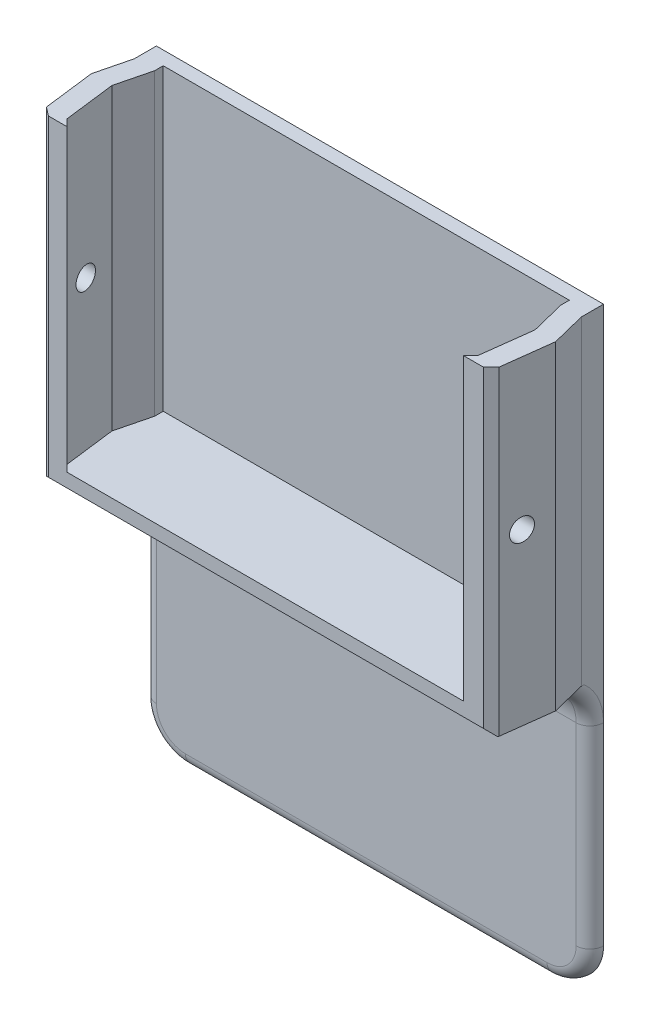
ISO-10303-21;
HEADER;
FILE_DESCRIPTION(('STEP AP214'),'2;1');
FILE_NAME('part.step','',(''),(''),'','','');
FILE_SCHEMA(('AUTOMOTIVE_DESIGN { 1 0 10303 214 1 1 1 1 }'));
ENDSEC;
DATA;
#1=APPLICATION_CONTEXT('core data for automotive mechanical design processes');
#2=APPLICATION_PROTOCOL_DEFINITION('international standard','automotive_design',2000,#1);
#3=PRODUCT_CONTEXT('',#1,'mechanical');
#4=PRODUCT('Part','Part','',(#3));
#5=PRODUCT_RELATED_PRODUCT_CATEGORY('part','',(#4));
#6=PRODUCT_DEFINITION_FORMATION('','',#4);
#7=PRODUCT_DEFINITION_CONTEXT('part definition',#1,'design');
#8=PRODUCT_DEFINITION('design','',#6,#7);
#9=PRODUCT_DEFINITION_SHAPE('','',#8);
#10=(LENGTH_UNIT() NAMED_UNIT(*) SI_UNIT(.MILLI.,.METRE.));
#11=(NAMED_UNIT(*) PLANE_ANGLE_UNIT() SI_UNIT($,.RADIAN.));
#12=(NAMED_UNIT(*) SI_UNIT($,.STERADIAN.) SOLID_ANGLE_UNIT());
#13=UNCERTAINTY_MEASURE_WITH_UNIT(LENGTH_MEASURE(1.E-05),#10,'distance_accuracy_value','');
#14=(GEOMETRIC_REPRESENTATION_CONTEXT(3) GLOBAL_UNCERTAINTY_ASSIGNED_CONTEXT((#13)) GLOBAL_UNIT_ASSIGNED_CONTEXT((#10,
#11,#12)) REPRESENTATION_CONTEXT('',''));
#15=CARTESIAN_POINT('',(0.,0.,0.));
#16=DIRECTION('',(0.,0.,1.));
#17=DIRECTION('',(1.,0.,0.));
#18=AXIS2_PLACEMENT_3D('',#15,#16,#17);
#19=CARTESIAN_POINT('',(-23.75,-17.5,1.));
#20=DIRECTION('',(0.,-1.,0.));
#21=DIRECTION('',(0.,0.,-1.));
#22=AXIS2_PLACEMENT_3D('',#19,#20,#21);
#23=PLANE('',#22);
#24=DIRECTION('',(-0.707106781186551,0.,-0.707106781186544));
#25=VECTOR('',#24,1.);
#26=CARTESIAN_POINT('',(-28.875,-17.5,6.12500000000005));
#27=LINE('',#26,#25);
#28=CARTESIAN_POINT('',(-23.2,-17.5,11.8));
#29=VERTEX_POINT('',#28);
#30=CARTESIAN_POINT('',(-24.,-17.5,11.));
#31=VERTEX_POINT('',#30);
#32=EDGE_CURVE('E276',#29,#31,#27,.T.);
#33=ORIENTED_EDGE('',*,*,#32,.F.);
#34=DIRECTION('',(1.,0.,0.));
#35=VECTOR('',#34,1.);
#36=CARTESIAN_POINT('',(-23.75,-17.5,11.8));
#37=LINE('',#36,#35);
#38=CARTESIAN_POINT('',(23.2,-17.5,11.8));
#39=VERTEX_POINT('',#38);
#40=EDGE_CURVE('E246',#29,#39,#37,.T.);
#41=ORIENTED_EDGE('',*,*,#40,.T.);
#42=DIRECTION('',(0.707106781186551,0.,-0.707106781186544));
#43=VECTOR('',#42,1.);
#44=CARTESIAN_POINT('',(5.12499999999977,-17.5,29.875));
#45=LINE('',#44,#43);
#46=CARTESIAN_POINT('',(24.,-17.5,11.));
#47=VERTEX_POINT('',#46);
#48=EDGE_CURVE('E290',#39,#47,#45,.T.);
#49=ORIENTED_EDGE('',*,*,#48,.T.);
#50=DIRECTION('',(0.124034734589208,0.,-0.992277876713668));
#51=VECTOR('',#50,1.);
#52=CARTESIAN_POINT('',(24.4961538461538,-17.5,7.03076923076921));
#53=LINE('',#52,#51);
#54=CARTESIAN_POINT('',(24.75,-17.5,5.));
#55=VERTEX_POINT('',#54);
#56=EDGE_CURVE('E321',#47,#55,#53,.T.);
#57=ORIENTED_EDGE('',*,*,#56,.T.);
#58=DIRECTION('',(-0.242535625036333,0.,-0.970142500145332));
#59=VECTOR('',#58,1.);
#60=CARTESIAN_POINT('',(20.9558823529412,-17.5,-10.1764705882353));
#61=LINE('',#60,#59);
#62=CARTESIAN_POINT('',(23.75,-17.5,1.));
#63=VERTEX_POINT('',#62);
#64=EDGE_CURVE('E325',#55,#63,#61,.T.);
#65=ORIENTED_EDGE('',*,*,#64,.T.);
#66=DIRECTION('',(0.,0.,-1.));
#67=VECTOR('',#66,1.);
#68=CARTESIAN_POINT('',(23.75,-17.5,1.));
#69=LINE('',#68,#67);
#70=CARTESIAN_POINT('',(23.75,-17.5,0.));
#71=VERTEX_POINT('',#70);
#72=EDGE_CURVE('E390',#63,#71,#69,.T.);
#73=ORIENTED_EDGE('',*,*,#72,.T.);
#74=DIRECTION('',(-1.,0.,0.));
#75=VECTOR('',#74,1.);
#76=CARTESIAN_POINT('',(-23.75,-17.5,0.));
#77=LINE('',#76,#75);
#78=CARTESIAN_POINT('',(-23.75,-17.5,0.));
#79=VERTEX_POINT('',#78);
#80=EDGE_CURVE('E369',#71,#79,#77,.T.);
#81=ORIENTED_EDGE('',*,*,#80,.T.);
#82=DIRECTION('',(0.,0.,-1.));
#83=VECTOR('',#82,1.);
#84=CARTESIAN_POINT('',(-23.75,-17.5,1.));
#85=LINE('',#84,#83);
#86=CARTESIAN_POINT('',(-23.75,-17.5,1.));
#87=VERTEX_POINT('',#86);
#88=EDGE_CURVE('E386',#87,#79,#85,.T.);
#89=ORIENTED_EDGE('',*,*,#88,.F.);
#90=DIRECTION('',(0.242535625036333,0.,-0.970142500145332));
#91=VECTOR('',#90,1.);
#92=CARTESIAN_POINT('',(-23.75,-17.5,1.));
#93=LINE('',#92,#91);
#94=CARTESIAN_POINT('',(-24.75,-17.5,5.));
#95=VERTEX_POINT('',#94);
#96=EDGE_CURVE('E279',#95,#87,#93,.T.);
#97=ORIENTED_EDGE('',*,*,#96,.F.);
#98=DIRECTION('',(-0.124034734589208,0.,-0.992277876713668));
#99=VECTOR('',#98,1.);
#100=CARTESIAN_POINT('',(-25.2269230769231,-17.5,1.18461538461538));
#101=LINE('',#100,#99);
#102=EDGE_CURVE('E282',#31,#95,#101,.T.);
#103=ORIENTED_EDGE('',*,*,#102,.F.);
#104=EDGE_LOOP('',(#33,#41,#49,#57,#65,#73,#81,#89,#97,#103));
#105=FACE_BOUND('',#104,.T.);
#106=ADVANCED_FACE('F43',(#105),#23,.F.);
#107=CARTESIAN_POINT('',(-26.15,-19.9,1.));
#108=DIRECTION('',(1.,0.,0.));
#109=DIRECTION('',(0.,1.,0.));
#110=AXIS2_PLACEMENT_3D('',#107,#108,#109);
#111=PLANE('',#110);
#112=DIRECTION('',(0.,-1.,0.));
#113=VECTOR('',#112,1.);
#114=CARTESIAN_POINT('',(-26.15,-52.5,-1.6));
#115=LINE('',#114,#113);
#116=CARTESIAN_POINT('',(-26.15,17.5,-1.6));
#117=VERTEX_POINT('',#116);
#118=CARTESIAN_POINT('',(-26.15,-24.9,-1.6));
#119=VERTEX_POINT('',#118);
#120=EDGE_CURVE('E340',#117,#119,#115,.T.);
#121=ORIENTED_EDGE('',*,*,#120,.T.);
#122=CARTESIAN_POINT('',(-26.15,-24.9,5.));
#123=DIRECTION('',(1.,0.,0.));
#124=DIRECTION('',(0.,1.,0.));
#125=AXIS2_PLACEMENT_3D('',#122,#123,#124);
#126=CIRCLE('',#125,6.6);
#127=CARTESIAN_POINT('',(-26.15,-19.9,0.691868154280908));
#128=VERTEX_POINT('',#127);
#129=EDGE_CURVE('E416',#119,#128,#126,.T.);
#130=ORIENTED_EDGE('',*,*,#129,.T.);
#131=DIRECTION('',(0.,0.,1.));
#132=VECTOR('',#131,1.);
#133=CARTESIAN_POINT('',(-26.15,-19.9,1.));
#134=LINE('',#133,#132);
#135=CARTESIAN_POINT('',(-26.15,-19.9,1.));
#136=VERTEX_POINT('',#135);
#137=EDGE_CURVE('E412',#128,#136,#134,.T.);
#138=ORIENTED_EDGE('',*,*,#137,.T.);
#139=DIRECTION('',(0.,-1.,0.));
#140=VECTOR('',#139,1.);
#141=CARTESIAN_POINT('',(-26.15,-19.9,1.));
#142=LINE('',#141,#140);
#143=CARTESIAN_POINT('',(-26.15,17.5,1.));
#144=VERTEX_POINT('',#143);
#145=EDGE_CURVE('E358',#144,#136,#142,.T.);
#146=ORIENTED_EDGE('',*,*,#145,.F.);
#147=DIRECTION('',(0.,0.,-1.));
#148=VECTOR('',#147,1.);
#149=CARTESIAN_POINT('',(-26.15,17.5,1.));
#150=LINE('',#149,#148);
#151=EDGE_CURVE('E379',#144,#117,#150,.T.);
#152=ORIENTED_EDGE('',*,*,#151,.T.);
#153=EDGE_LOOP('',(#121,#130,#138,#146,#152));
#154=FACE_BOUND('',#153,.T.);
#155=ADVANCED_FACE('F525',(#154),#111,.F.);
#156=CARTESIAN_POINT('',(23.75,-17.5,1.));
#157=DIRECTION('',(1.,0.,0.));
#158=DIRECTION('',(0.,0.,-1.));
#159=AXIS2_PLACEMENT_3D('',#156,#157,#158);
#160=PLANE('',#159);
#161=DIRECTION('',(0.,-1.,0.));
#162=VECTOR('',#161,1.);
#163=CARTESIAN_POINT('',(23.75,-17.5,0.));
#164=LINE('',#163,#162);
#165=CARTESIAN_POINT('',(23.75,17.5,0.));
#166=VERTEX_POINT('',#165);
#167=EDGE_CURVE('E348',#166,#71,#164,.T.);
#168=ORIENTED_EDGE('',*,*,#167,.T.);
#169=ORIENTED_EDGE('',*,*,#72,.F.);
#170=DIRECTION('',(0.,-1.,0.));
#171=VECTOR('',#170,1.);
#172=CARTESIAN_POINT('',(23.75,-17.5,1.));
#173=LINE('',#172,#171);
#174=CARTESIAN_POINT('',(23.75,17.5,1.));
#175=VERTEX_POINT('',#174);
#176=EDGE_CURVE('E351',#175,#63,#173,.T.);
#177=ORIENTED_EDGE('',*,*,#176,.F.);
#178=DIRECTION('',(0.,0.,-1.));
#179=VECTOR('',#178,1.);
#180=CARTESIAN_POINT('',(23.75,17.5,1.));
#181=LINE('',#180,#179);
#182=EDGE_CURVE('E394',#175,#166,#181,.T.);
#183=ORIENTED_EDGE('',*,*,#182,.T.);
#184=EDGE_LOOP('',(#168,#169,#177,#183));
#185=FACE_BOUND('',#184,.T.);
#186=ADVANCED_FACE('F531',(#185),#160,.F.);
#187=CARTESIAN_POINT('',(-23.75,-17.5,1.));
#188=DIRECTION('',(-1.,0.,0.));
#189=DIRECTION('',(0.,0.,1.));
#190=AXIS2_PLACEMENT_3D('',#187,#188,#189);
#191=PLANE('',#190);
#192=DIRECTION('',(0.,1.,0.));
#193=VECTOR('',#192,1.);
#194=CARTESIAN_POINT('',(-23.75,-17.5,0.));
#195=LINE('',#194,#193);
#196=CARTESIAN_POINT('',(-23.75,17.5,0.));
#197=VERTEX_POINT('',#196);
#198=EDGE_CURVE('E355',#79,#197,#195,.T.);
#199=ORIENTED_EDGE('',*,*,#198,.T.);
#200=DIRECTION('',(0.,0.,-1.));
#201=VECTOR('',#200,1.);
#202=CARTESIAN_POINT('',(-23.75,17.5,1.));
#203=LINE('',#202,#201);
#204=CARTESIAN_POINT('',(-23.75,17.5,1.));
#205=VERTEX_POINT('',#204);
#206=EDGE_CURVE('E382',#205,#197,#203,.T.);
#207=ORIENTED_EDGE('',*,*,#206,.F.);
#208=DIRECTION('',(0.,1.,0.));
#209=VECTOR('',#208,1.);
#210=CARTESIAN_POINT('',(-23.75,-17.5,1.));
#211=LINE('',#210,#209);
#212=EDGE_CURVE('E354',#87,#205,#211,.T.);
#213=ORIENTED_EDGE('',*,*,#212,.F.);
#214=ORIENTED_EDGE('',*,*,#88,.T.);
#215=EDGE_LOOP('',(#199,#207,#213,#214));
#216=FACE_BOUND('',#215,.T.);
#217=ADVANCED_FACE('F534',(#216),#191,.F.);
#218=CARTESIAN_POINT('',(-26.15,17.5,1.));
#219=DIRECTION('',(0.,-1.,0.));
#220=DIRECTION('',(0.,0.,-1.));
#221=AXIS2_PLACEMENT_3D('',#218,#219,#220);
#222=PLANE('',#221);
#223=DIRECTION('',(1.,0.,0.));
#224=VECTOR('',#223,1.);
#225=CARTESIAN_POINT('',(-26.3,17.5,11.8));
#226=LINE('',#225,#224);
#227=CARTESIAN_POINT('',(23.2,17.5,11.8));
#228=VERTEX_POINT('',#227);
#229=CARTESIAN_POINT('',(25.5,17.5,11.8));
#230=VERTEX_POINT('',#229);
#231=EDGE_CURVE('E241',#228,#230,#226,.T.);
#232=ORIENTED_EDGE('',*,*,#231,.T.);
#233=DIRECTION('',(0.707106781186549,0.,-0.707106781186546));
#234=VECTOR('',#233,1.);
#235=CARTESIAN_POINT('',(26.4142857142857,17.5,10.8857142857143));
#236=LINE('',#235,#234);
#237=CARTESIAN_POINT('',(26.4142857142857,17.5,10.8857142857143));
#238=VERTEX_POINT('',#237);
#239=EDGE_CURVE('E701',#230,#238,#236,.T.);
#240=ORIENTED_EDGE('',*,*,#239,.T.);
#241=DIRECTION('',(0.124034734589209,0.,-0.992277876713668));
#242=VECTOR('',#241,1.);
#243=CARTESIAN_POINT('',(27.15,17.5,5.));
#244=LINE('',#243,#242);
#245=CARTESIAN_POINT('',(27.15,17.5,5.));
#246=VERTEX_POINT('',#245);
#247=EDGE_CURVE('E303',#238,#246,#244,.T.);
#248=ORIENTED_EDGE('',*,*,#247,.T.);
#249=DIRECTION('',(-0.242535625036333,0.,-0.970142500145332));
#250=VECTOR('',#249,1.);
#251=CARTESIAN_POINT('',(26.15,17.5,1.));
#252=LINE('',#251,#250);
#253=CARTESIAN_POINT('',(26.15,17.5,1.));
#254=VERTEX_POINT('',#253);
#255=EDGE_CURVE('E306',#246,#254,#252,.T.);
#256=ORIENTED_EDGE('',*,*,#255,.T.);
#257=DIRECTION('',(0.,0.,-1.));
#258=VECTOR('',#257,1.);
#259=CARTESIAN_POINT('',(26.15,17.5,1.));
#260=LINE('',#259,#258);
#261=CARTESIAN_POINT('',(26.15,17.5,-1.6));
#262=VERTEX_POINT('',#261);
#263=EDGE_CURVE('E365',#254,#262,#260,.T.);
#264=ORIENTED_EDGE('',*,*,#263,.T.);
#265=DIRECTION('',(-1.,0.,0.));
#266=VECTOR('',#265,1.);
#267=CARTESIAN_POINT('',(-26.15,17.5,-1.6));
#268=LINE('',#267,#266);
#269=EDGE_CURVE('E334',#262,#117,#268,.T.);
#270=ORIENTED_EDGE('',*,*,#269,.T.);
#271=ORIENTED_EDGE('',*,*,#151,.F.);
#272=DIRECTION('',(0.242535625036333,0.,-0.970142500145332));
#273=VECTOR('',#272,1.);
#274=CARTESIAN_POINT('',(-26.15,17.5,1.));
#275=LINE('',#274,#273);
#276=CARTESIAN_POINT('',(-27.15,17.5,5.));
#277=VERTEX_POINT('',#276);
#278=EDGE_CURVE('E263',#277,#144,#275,.T.);
#279=ORIENTED_EDGE('',*,*,#278,.F.);
#280=DIRECTION('',(-0.124034734589209,0.,-0.992277876713668));
#281=VECTOR('',#280,1.);
#282=CARTESIAN_POINT('',(-27.15,17.5,5.));
#283=LINE('',#282,#281);
#284=CARTESIAN_POINT('',(-26.3992277876714,17.5,11.006177698629));
#285=VERTEX_POINT('',#284);
#286=EDGE_CURVE('E257',#285,#277,#283,.T.);
#287=ORIENTED_EDGE('',*,*,#286,.F.);
#288=DIRECTION('',(-0.789352217376322,0.,-0.613940613514926));
#289=VECTOR('',#288,1.);
#290=CARTESIAN_POINT('',(-25.3785991144801,17.5,11.8));
#291=LINE('',#290,#289);
#292=CARTESIAN_POINT('',(-25.3785991144801,17.5,11.8));
#293=VERTEX_POINT('',#292);
#294=EDGE_CURVE('E236',#285,#293,#291,.F.);
#295=ORIENTED_EDGE('',*,*,#294,.T.);
#296=CARTESIAN_POINT('',(-23.2,17.5,11.8));
#297=VERTEX_POINT('',#296);
#298=EDGE_CURVE('E228',#293,#297,#226,.T.);
#299=ORIENTED_EDGE('',*,*,#298,.T.);
#300=DIRECTION('',(0.707106781186551,0.,0.707106781186544));
#301=VECTOR('',#300,1.);
#302=CARTESIAN_POINT('',(-24.,17.5,11.));
#303=LINE('',#302,#301);
#304=CARTESIAN_POINT('',(-24.,17.5,11.));
#305=VERTEX_POINT('',#304);
#306=EDGE_CURVE('E234',#305,#297,#303,.T.);
#307=ORIENTED_EDGE('',*,*,#306,.F.);
#308=DIRECTION('',(0.124034734589208,0.,0.992277876713668));
#309=VECTOR('',#308,1.);
#310=CARTESIAN_POINT('',(-24.75,17.5,5.));
#311=LINE('',#310,#309);
#312=CARTESIAN_POINT('',(-24.75,17.5,5.));
#313=VERTEX_POINT('',#312);
#314=EDGE_CURVE('E256',#313,#305,#311,.T.);
#315=ORIENTED_EDGE('',*,*,#314,.F.);
#316=DIRECTION('',(-0.242535625036333,0.,0.970142500145332));
#317=VECTOR('',#316,1.);
#318=CARTESIAN_POINT('',(-24.75,17.5,5.));
#319=LINE('',#318,#317);
#320=EDGE_CURVE('E567',#205,#313,#319,.T.);
#321=ORIENTED_EDGE('',*,*,#320,.F.);
#322=ORIENTED_EDGE('',*,*,#206,.T.);
#323=DIRECTION('',(-1.,0.,0.));
#324=VECTOR('',#323,1.);
#325=CARTESIAN_POINT('',(-26.15,17.5,0.));
#326=LINE('',#325,#324);
#327=EDGE_CURVE('E329',#166,#197,#326,.T.);
#328=ORIENTED_EDGE('',*,*,#327,.F.);
#329=ORIENTED_EDGE('',*,*,#182,.F.);
#330=DIRECTION('',(0.242535625036333,0.,0.970142500145332));
#331=VECTOR('',#330,1.);
#332=CARTESIAN_POINT('',(24.75,17.5,5.));
#333=LINE('',#332,#331);
#334=CARTESIAN_POINT('',(24.75,17.5,5.));
#335=VERTEX_POINT('',#334);
#336=EDGE_CURVE('E285',#175,#335,#333,.T.);
#337=ORIENTED_EDGE('',*,*,#336,.T.);
#338=DIRECTION('',(-0.124034734589208,0.,0.992277876713668));
#339=VECTOR('',#338,1.);
#340=CARTESIAN_POINT('',(24.75,17.5,5.));
#341=LINE('',#340,#339);
#342=CARTESIAN_POINT('',(24.,17.5,11.));
#343=VERTEX_POINT('',#342);
#344=EDGE_CURVE('E295',#335,#343,#341,.T.);
#345=ORIENTED_EDGE('',*,*,#344,.T.);
#346=DIRECTION('',(-0.707106781186551,0.,0.707106781186544));
#347=VECTOR('',#346,1.);
#348=CARTESIAN_POINT('',(24.,17.5,11.));
#349=LINE('',#348,#347);
#350=EDGE_CURVE('E299',#343,#228,#349,.T.);
#351=ORIENTED_EDGE('',*,*,#350,.T.);
#352=EDGE_LOOP('',(#232,#240,#248,#256,#264,#270,#271,#279,#287,#295,#299,#307,#315,#321,#322,
#328,#329,#337,#345,#351));
#353=FACE_BOUND('',#352,.T.);
#354=ADVANCED_FACE('F231',(#353),#222,.F.);
#355=CARTESIAN_POINT('',(-26.15,-19.9,1.));
#356=DIRECTION('',(0.,1.,0.));
#357=DIRECTION('',(-1.,0.,0.));
#358=AXIS2_PLACEMENT_3D('',#355,#356,#357);
#359=PLANE('',#358);
#360=DIRECTION('',(-0.124034734589209,0.,0.992277876713668));
#361=VECTOR('',#360,1.);
#362=CARTESIAN_POINT('',(27.15,-19.9,5.));
#363=LINE('',#362,#361);
#364=CARTESIAN_POINT('',(27.15,-19.9,5.));
#365=VERTEX_POINT('',#364);
#366=CARTESIAN_POINT('',(26.4142857142857,-19.9,10.8857142857143));
#367=VERTEX_POINT('',#366);
#368=EDGE_CURVE('E286',#365,#367,#363,.T.);
#369=ORIENTED_EDGE('',*,*,#368,.T.);
#370=DIRECTION('',(-0.707106781186549,0.,0.707106781186546));
#371=VECTOR('',#370,1.);
#372=CARTESIAN_POINT('',(26.4142857142857,-19.9,10.8857142857143));
#373=LINE('',#372,#371);
#374=CARTESIAN_POINT('',(26.3,-19.9,11.));
#375=VERTEX_POINT('',#374);
#376=EDGE_CURVE('E687',#367,#375,#373,.T.);
#377=ORIENTED_EDGE('',*,*,#376,.T.);
#378=DIRECTION('',(-1.,0.,0.));
#379=VECTOR('',#378,1.);
#380=CARTESIAN_POINT('',(-26.15,-19.9,11.));
#381=LINE('',#380,#379);
#382=CARTESIAN_POINT('',(-26.4,-19.9,11.));
#383=VERTEX_POINT('',#382);
#384=EDGE_CURVE('E684',#375,#383,#381,.T.);
#385=ORIENTED_EDGE('',*,*,#384,.T.);
#386=DIRECTION('',(0.124034734589209,0.,0.992277876713668));
#387=VECTOR('',#386,1.);
#388=CARTESIAN_POINT('',(-27.15,-19.9,5.));
#389=LINE('',#388,#387);
#390=CARTESIAN_POINT('',(-27.15,-19.9,5.));
#391=VERTEX_POINT('',#390);
#392=EDGE_CURVE('E270',#391,#383,#389,.T.);
#393=ORIENTED_EDGE('',*,*,#392,.F.);
#394=DIRECTION('',(-0.242535625036333,0.,0.970142500145332));
#395=VECTOR('',#394,1.);
#396=CARTESIAN_POINT('',(-26.15,-19.9,1.));
#397=LINE('',#396,#395);
#398=EDGE_CURVE('E420',#136,#391,#397,.T.);
#399=ORIENTED_EDGE('',*,*,#398,.F.);
#400=ORIENTED_EDGE('',*,*,#137,.F.);
#401=CARTESIAN_POINT('',(-26.1350568245356,-19.9,0.364556174732627));
#402=CARTESIAN_POINT('',(-26.1454010435106,-19.9,0.475401887087534));
#403=CARTESIAN_POINT('',(-26.1501662887865,-19.9,0.586616381653472));
#404=CARTESIAN_POINT('',(-26.1498246171678,-19.9,0.808806938362691));
#405=CARTESIAN_POINT('',(-26.1447391745743,-19.9,0.919782992361803));
#406=CARTESIAN_POINT('',(-26.116949716237,-19.9,1.24812937825687));
#407=CARTESIAN_POINT('',(-26.081952884663,-19.9,1.46445720370642));
#408=CARTESIAN_POINT('',(-25.9784264198526,-19.9,1.92973722810322));
#409=CARTESIAN_POINT('',(-25.9049835692338,-19.9,2.17752847487726));
#410=CARTESIAN_POINT('',(-25.7336320332519,-19.9,2.66463224499081));
#411=CARTESIAN_POINT('',(-25.6356834768563,-19.9,2.90393021801355));
#412=CARTESIAN_POINT('',(-25.4225026369685,-19.9,3.3772699848951));
#413=CARTESIAN_POINT('',(-25.3071138679279,-19.9,3.6112395285502));
#414=CARTESIAN_POINT('',(-25.0666502588156,-19.9,4.0738771013353));
#415=CARTESIAN_POINT('',(-24.9415806066588,-19.9,4.30254788581994));
#416=CARTESIAN_POINT('',(-24.729300838975,-19.9,4.68298078065714));
#417=CARTESIAN_POINT('',(-24.6431439507029,-19.9,4.83534170560166));
#418=CARTESIAN_POINT('',(-24.554642071766,-19.9,4.99179389982028));
#419=CARTESIAN_POINT('',(-24.5523210363567,-19.9,4.99589694949388));
#420=CARTESIAN_POINT('',(-24.55,-19.9,5.));
#421=B_SPLINE_CURVE_WITH_KNOTS('',3,(#401,#402,#403,#404,#405,#406,#407,#408,#409,#410,#411,
#412,#413,#414,#415,#416,#417,#418,#419,#420),.UNSPECIFIED.,.F.,.F.,(4,2,2,2,2,2,2,2,2,4),(0.,
0.333611198179571,0.666495949090526,1.32175102029185,2.09530321749961,2.87012227113956,
3.65235890204616,4.43417920224677,4.95928560472672,4.97342774035069),.UNSPECIFIED.);
#422=CARTESIAN_POINT('',(-24.55,-19.9,5.));
#423=VERTEX_POINT('',#422);
#424=EDGE_CURVE('E455',#128,#423,#421,.T.);
#425=ORIENTED_EDGE('',*,*,#424,.T.);
#426=DIRECTION('',(1.,0.,0.));
#427=VECTOR('',#426,1.);
#428=CARTESIAN_POINT('',(26.15,-19.9,5.));
#429=LINE('',#428,#427);
#430=CARTESIAN_POINT('',(24.55,-19.9,5.));
#431=VERTEX_POINT('',#430);
#432=EDGE_CURVE('E398',#423,#431,#429,.T.);
#433=ORIENTED_EDGE('',*,*,#432,.T.);
#434=CARTESIAN_POINT('',(24.55,-19.9,5.));
#435=CARTESIAN_POINT('',(24.5523210010373,-19.9,4.99589697513059));
#436=CARTESIAN_POINT('',(24.5546420368388,-19.9,4.9917939251996));
#437=CARTESIAN_POINT('',(24.8218211977392,-19.9,4.5194830906612));
#438=CARTESIAN_POINT('',(25.0869021484888,-19.9,4.05083663093539));
#439=CARTESIAN_POINT('',(25.4446497375613,-19.9,3.32972429594478));
#440=CARTESIAN_POINT('',(25.5569133000121,-19.9,3.08725269862257));
#441=CARTESIAN_POINT('',(25.7605635754246,-19.9,2.59361949842707));
#442=CARTESIAN_POINT('',(25.8519712569603,-19.9,2.34246691868268));
#443=CARTESIAN_POINT('',(25.9662073936563,-19.9,1.95790780569791));
#444=CARTESIAN_POINT('',(26.0005555522324,-19.9,1.82793337308751));
#445=CARTESIAN_POINT('',(26.0598240705568,-19.9,1.56593763048421));
#446=CARTESIAN_POINT('',(26.0847527237751,-19.9,1.43391822813124));
#447=CARTESIAN_POINT('',(26.1237978196543,-19.9,1.1657567911855));
#448=CARTESIAN_POINT('',(26.1377094799476,-19.9,1.02958343986744));
#449=CARTESIAN_POINT('',(26.1482779192977,-19.9,0.824594065999382));
#450=CARTESIAN_POINT('',(26.1500786612778,-19.9,0.756029371086252));
#451=CARTESIAN_POINT('',(26.1499161351136,-19.9,0.618868940205122));
#452=CARTESIAN_POINT('',(26.1479507644809,-19.9,0.550273208284246));
#453=CARTESIAN_POINT('',(26.1439488960234,-19.9,0.481769390561203));
#454=B_SPLINE_CURVE_WITH_KNOTS('',3,(#434,#435,#436,#437,#438,#439,#440,#441,#442,#443,#444,
#445,#446,#447,#448,#449,#450,#451,#452,#453),.UNSPECIFIED.,.F.,.F.,(4,2,2,2,2,2,2,2,2,4),(0.,
0.0141421356237437,1.62791804731016,2.42894592279462,3.22916485802935,3.6321916774761,
4.03486281765653,4.44485373402258,4.65052669732284,4.85631451406686),.UNSPECIFIED.);
#455=CARTESIAN_POINT('',(26.15,-19.9,0.691868154292399));
#456=VERTEX_POINT('',#455);
#457=EDGE_CURVE('E464',#431,#456,#454,.T.);
#458=ORIENTED_EDGE('',*,*,#457,.T.);
#459=DIRECTION('',(0.,0.,-1.));
#460=VECTOR('',#459,1.);
#461=CARTESIAN_POINT('',(26.15,-19.9,1.));
#462=LINE('',#461,#460);
#463=CARTESIAN_POINT('',(26.15,-19.9,1.));
#464=VERTEX_POINT('',#463);
#465=EDGE_CURVE('E444',#464,#456,#462,.T.);
#466=ORIENTED_EDGE('',*,*,#465,.F.);
#467=DIRECTION('',(-0.242535625036333,0.,-0.970142500145332));
#468=VECTOR('',#467,1.);
#469=CARTESIAN_POINT('',(23.0735294117647,-19.9,-11.3058823529412));
#470=LINE('',#469,#468);
#471=EDGE_CURVE('E451',#365,#464,#470,.T.);
#472=ORIENTED_EDGE('',*,*,#471,.F.);
#473=EDGE_LOOP('',(#369,#377,#385,#393,#399,#400,#425,#433,#458,#466,#472));
#474=FACE_BOUND('',#473,.T.);
#475=ADVANCED_FACE('F471',(#474),#359,.F.);
#476=CARTESIAN_POINT('',(26.15,-19.9,1.));
#477=DIRECTION('',(-1.,0.,0.));
#478=DIRECTION('',(0.,0.,1.));
#479=AXIS2_PLACEMENT_3D('',#476,#477,#478);
#480=PLANE('',#479);
#481=ORIENTED_EDGE('',*,*,#465,.T.);
#482=CARTESIAN_POINT('',(26.15,-24.9,5.));
#483=DIRECTION('',(-1.,0.,0.));
#484=DIRECTION('',(0.,0.,1.));
#485=AXIS2_PLACEMENT_3D('',#482,#483,#484);
#486=CIRCLE('',#485,6.6);
#487=CARTESIAN_POINT('',(26.15,-24.9,-1.6));
#488=VERTEX_POINT('',#487);
#489=EDGE_CURVE('E448',#456,#488,#486,.T.);
#490=ORIENTED_EDGE('',*,*,#489,.T.);
#491=DIRECTION('',(0.,1.,0.));
#492=VECTOR('',#491,1.);
#493=CARTESIAN_POINT('',(26.15,-52.5,-1.6));
#494=LINE('',#493,#492);
#495=EDGE_CURVE('E335',#488,#262,#494,.T.);
#496=ORIENTED_EDGE('',*,*,#495,.T.);
#497=ORIENTED_EDGE('',*,*,#263,.F.);
#498=DIRECTION('',(0.,1.,0.));
#499=VECTOR('',#498,1.);
#500=CARTESIAN_POINT('',(26.15,-19.9,1.));
#501=LINE('',#500,#499);
#502=EDGE_CURVE('E362',#464,#254,#501,.T.);
#503=ORIENTED_EDGE('',*,*,#502,.F.);
#504=EDGE_LOOP('',(#481,#490,#496,#497,#503));
#505=FACE_BOUND('',#504,.T.);
#506=ADVANCED_FACE('F653',(#505),#480,.F.);
#507=CARTESIAN_POINT('',(0.,0.,0.));
#508=DIRECTION('',(0.,0.,-1.));
#509=DIRECTION('',(-1.,0.,0.));
#510=AXIS2_PLACEMENT_3D('',#507,#508,#509);
#511=PLANE('',#510);
#512=DIRECTION('',(1.,0.,0.));
#513=VECTOR('',#512,1.);
#514=CARTESIAN_POINT('',(-26.15,-24.9,0.));
#515=LINE('',#514,#513);
#516=CARTESIAN_POINT('',(24.55,-24.9,0.));
#517=VERTEX_POINT('',#516);
#518=CARTESIAN_POINT('',(-24.55,-24.9,0.));
#519=VERTEX_POINT('',#518);
#520=EDGE_CURVE('E402',#517,#519,#515,.F.);
#521=ORIENTED_EDGE('',*,*,#520,.T.);
#522=DIRECTION('',(0.,-1.,0.));
#523=VECTOR('',#522,1.);
#524=CARTESIAN_POINT('',(-24.55,0.,0.));
#525=LINE('',#524,#523);
#526=CARTESIAN_POINT('',(-24.55,-47.5,0.));
#527=VERTEX_POINT('',#526);
#528=EDGE_CURVE('E441',#519,#527,#525,.T.);
#529=ORIENTED_EDGE('',*,*,#528,.T.);
#530=CARTESIAN_POINT('',(-21.15,-47.5,0.));
#531=DIRECTION('',(0.,0.,-1.));
#532=DIRECTION('',(-1.,0.,0.));
#533=AXIS2_PLACEMENT_3D('',#530,#531,#532);
#534=CIRCLE('',#533,3.4);
#535=CARTESIAN_POINT('',(-21.15,-50.9,0.));
#536=VERTEX_POINT('',#535);
#537=EDGE_CURVE('E438',#527,#536,#534,.F.);
#538=ORIENTED_EDGE('',*,*,#537,.T.);
#539=DIRECTION('',(1.,0.,0.));
#540=VECTOR('',#539,1.);
#541=CARTESIAN_POINT('',(21.15,-50.9,0.));
#542=LINE('',#541,#540);
#543=CARTESIAN_POINT('',(21.15,-50.9,0.));
#544=VERTEX_POINT('',#543);
#545=EDGE_CURVE('E429',#536,#544,#542,.T.);
#546=ORIENTED_EDGE('',*,*,#545,.T.);
#547=CARTESIAN_POINT('',(21.15,-47.5,0.));
#548=DIRECTION('',(0.,0.,-1.));
#549=DIRECTION('',(-1.,0.,0.));
#550=AXIS2_PLACEMENT_3D('',#547,#548,#549);
#551=CIRCLE('',#550,3.4);
#552=CARTESIAN_POINT('',(24.55,-47.5,0.));
#553=VERTEX_POINT('',#552);
#554=EDGE_CURVE('E432',#544,#553,#551,.F.);
#555=ORIENTED_EDGE('',*,*,#554,.T.);
#556=DIRECTION('',(0.,1.,0.));
#557=VECTOR('',#556,1.);
#558=CARTESIAN_POINT('',(24.55,0.,0.));
#559=LINE('',#558,#557);
#560=EDGE_CURVE('E435',#553,#517,#559,.T.);
#561=ORIENTED_EDGE('',*,*,#560,.T.);
#562=EDGE_LOOP('',(#521,#529,#538,#546,#555,#561));
#563=FACE_BOUND('',#562,.T.);
#564=ADVANCED_FACE('F650',(#563),#511,.F.);
#565=CARTESIAN_POINT('',(0.,0.,-1.6));
#566=DIRECTION('',(0.,0.,-1.));
#567=DIRECTION('',(-1.,0.,0.));
#568=AXIS2_PLACEMENT_3D('',#565,#566,#567);
#569=PLANE('',#568);
#570=CARTESIAN_POINT('',(26.15,-47.5,-1.6));
#571=VERTEX_POINT('',#570);
#572=EDGE_CURVE('E330',#571,#488,#494,.T.);
#573=ORIENTED_EDGE('',*,*,#572,.F.);
#574=CARTESIAN_POINT('',(21.15,-47.5,-1.6));
#575=DIRECTION('',(0.,0.,-1.));
#576=DIRECTION('',(-1.,0.,0.));
#577=AXIS2_PLACEMENT_3D('',#574,#575,#576);
#578=CIRCLE('',#577,5.);
#579=CARTESIAN_POINT('',(21.15,-52.5,-1.6));
#580=VERTEX_POINT('',#579);
#581=EDGE_CURVE('E409',#571,#580,#578,.T.);
#582=ORIENTED_EDGE('',*,*,#581,.T.);
#583=DIRECTION('',(1.,0.,0.));
#584=VECTOR('',#583,1.);
#585=CARTESIAN_POINT('',(-26.15,-52.5,-1.6));
#586=LINE('',#585,#584);
#587=CARTESIAN_POINT('',(-21.15,-52.5,-1.6));
#588=VERTEX_POINT('',#587);
#589=EDGE_CURVE('E344',#588,#580,#586,.T.);
#590=ORIENTED_EDGE('',*,*,#589,.F.);
#591=CARTESIAN_POINT('',(-21.15,-47.5,-1.6));
#592=DIRECTION('',(0.,0.,-1.));
#593=DIRECTION('',(-1.,0.,0.));
#594=AXIS2_PLACEMENT_3D('',#591,#592,#593);
#595=CIRCLE('',#594,5.);
#596=CARTESIAN_POINT('',(-26.15,-47.5,-1.6));
#597=VERTEX_POINT('',#596);
#598=EDGE_CURVE('E406',#588,#597,#595,.T.);
#599=ORIENTED_EDGE('',*,*,#598,.T.);
#600=EDGE_CURVE('E339',#119,#597,#115,.T.);
#601=ORIENTED_EDGE('',*,*,#600,.F.);
#602=ORIENTED_EDGE('',*,*,#120,.F.);
#603=ORIENTED_EDGE('',*,*,#269,.F.);
#604=ORIENTED_EDGE('',*,*,#495,.F.);
#605=EDGE_LOOP('',(#573,#582,#590,#599,#601,#602,#603,#604));
#606=FACE_BOUND('',#605,.T.);
#607=ADVANCED_FACE('F647',(#606),#569,.T.);
#608=ORIENTED_EDGE('',*,*,#198,.F.);
#609=ORIENTED_EDGE('',*,*,#80,.F.);
#610=ORIENTED_EDGE('',*,*,#167,.F.);
#611=ORIENTED_EDGE('',*,*,#327,.T.);
#612=EDGE_LOOP('',(#608,#609,#610,#611));
#613=FACE_BOUND('',#612,.T.);
#614=ADVANCED_FACE('F559',(#613),#511,.F.);
#615=CARTESIAN_POINT('',(24.75,-32.958426398307,5.));
#616=DIRECTION('',(-0.970142500145332,0.,0.242535625036333));
#617=DIRECTION('',(0.242535625036333,0.,0.970142500145332));
#618=AXIS2_PLACEMENT_3D('',#615,#616,#617);
#619=PLANE('',#618);
#620=ORIENTED_EDGE('',*,*,#64,.F.);
#621=DIRECTION('',(0.,1.,0.));
#622=VECTOR('',#621,1.);
#623=CARTESIAN_POINT('',(24.75,-32.958426398307,5.));
#624=LINE('',#623,#622);
#625=EDGE_CURVE('E310',#55,#335,#624,.T.);
#626=ORIENTED_EDGE('',*,*,#625,.T.);
#627=ORIENTED_EDGE('',*,*,#336,.F.);
#628=ORIENTED_EDGE('',*,*,#176,.T.);
#629=EDGE_LOOP('',(#620,#626,#627,#628));
#630=FACE_BOUND('',#629,.T.);
#631=ADVANCED_FACE('F551',(#630),#619,.T.);
#632=CARTESIAN_POINT('',(24.75,-32.958426398307,5.));
#633=DIRECTION('',(-0.992277876713668,0.,-0.124034734589208));
#634=DIRECTION('',(-0.124034734589208,0.,0.992277876713668));
#635=AXIS2_PLACEMENT_3D('',#632,#633,#634);
#636=PLANE('',#635);
#637=CARTESIAN_POINT('',(24.3125,0.,8.5));
#638=DIRECTION('',(-0.992277876713668,0.,-0.124034734589208));
#639=DIRECTION('',(0.124034734589208,0.,-0.992277876713668));
#640=AXIS2_PLACEMENT_3D('',#637,#638,#639);
#641=ELLIPSE('',#640,1.31011688409851,1.3);
#642=CARTESIAN_POINT('',(24.475,0.,7.2));
#643=VERTEX_POINT('',#642);
#644=EDGE_CURVE('E587',#643,#643,#641,.T.);
#645=ORIENTED_EDGE('',*,*,#644,.F.);
#646=EDGE_LOOP('',(#645));
#647=FACE_BOUND('',#646,.T.);
#648=ORIENTED_EDGE('',*,*,#56,.F.);
#649=DIRECTION('',(0.,1.,0.));
#650=VECTOR('',#649,1.);
#651=CARTESIAN_POINT('',(24.,-32.958426398307,11.));
#652=LINE('',#651,#650);
#653=EDGE_CURVE('E314',#47,#343,#652,.T.);
#654=ORIENTED_EDGE('',*,*,#653,.T.);
#655=ORIENTED_EDGE('',*,*,#344,.F.);
#656=ORIENTED_EDGE('',*,*,#625,.F.);
#657=EDGE_LOOP('',(#648,#654,#655,#656));
#658=FACE_BOUND('',#657,.T.);
#659=ADVANCED_FACE('F554',(#647,#658),#636,.T.);
#660=CARTESIAN_POINT('',(24.,-32.958426398307,11.));
#661=DIRECTION('',(-0.707106781186544,0.,-0.707106781186551));
#662=DIRECTION('',(-0.707106781186551,0.,0.707106781186544));
#663=AXIS2_PLACEMENT_3D('',#660,#661,#662);
#664=PLANE('',#663);
#665=DIRECTION('',(0.,-1.,0.));
#666=VECTOR('',#665,1.);
#667=CARTESIAN_POINT('',(23.2,-32.958426398307,11.8));
#668=LINE('',#667,#666);
#669=EDGE_CURVE('E581',#228,#39,#668,.T.);
#670=ORIENTED_EDGE('',*,*,#669,.F.);
#671=ORIENTED_EDGE('',*,*,#350,.F.);
#672=ORIENTED_EDGE('',*,*,#653,.F.);
#673=ORIENTED_EDGE('',*,*,#48,.F.);
#674=EDGE_LOOP('',(#670,#671,#672,#673));
#675=FACE_BOUND('',#674,.T.);
#676=ADVANCED_FACE('F634',(#675),#664,.T.);
#677=CARTESIAN_POINT('',(26.15,-32.958426398307,1.));
#678=DIRECTION('',(0.970142500145332,0.,-0.242535625036333));
#679=DIRECTION('',(-0.242535625036333,0.,-0.970142500145332));
#680=AXIS2_PLACEMENT_3D('',#677,#678,#679);
#681=PLANE('',#680);
#682=DIRECTION('',(0.,1.,0.));
#683=VECTOR('',#682,1.);
#684=CARTESIAN_POINT('',(27.15,-32.958426398307,5.));
#685=LINE('',#684,#683);
#686=EDGE_CURVE('E291',#365,#246,#685,.T.);
#687=ORIENTED_EDGE('',*,*,#686,.F.);
#688=ORIENTED_EDGE('',*,*,#471,.T.);
#689=ORIENTED_EDGE('',*,*,#502,.T.);
#690=ORIENTED_EDGE('',*,*,#255,.F.);
#691=EDGE_LOOP('',(#687,#688,#689,#690));
#692=FACE_BOUND('',#691,.T.);
#693=ADVANCED_FACE('F631',(#692),#681,.T.);
#694=CARTESIAN_POINT('',(27.15,-32.958426398307,5.));
#695=DIRECTION('',(0.992277876713668,0.,0.124034734589209));
#696=DIRECTION('',(0.124034734589209,0.,-0.992277876713668));
#697=AXIS2_PLACEMENT_3D('',#694,#695,#696);
#698=PLANE('',#697);
#699=CARTESIAN_POINT('',(26.7125,0.,8.5));
#700=DIRECTION('',(0.992277876713668,0.,0.124034734589209));
#701=DIRECTION('',(0.124034734589209,0.,-0.992277876713668));
#702=AXIS2_PLACEMENT_3D('',#699,#700,#701);
#703=ELLIPSE('',#702,1.31011688409851,1.3);
#704=CARTESIAN_POINT('',(26.875,0.,7.2));
#705=VERTEX_POINT('',#704);
#706=EDGE_CURVE('E592',#705,#705,#703,.T.);
#707=ORIENTED_EDGE('',*,*,#706,.F.);
#708=EDGE_LOOP('',(#707));
#709=FACE_BOUND('',#708,.T.);
#710=ORIENTED_EDGE('',*,*,#247,.F.);
#711=DIRECTION('',(0.,-1.,0.));
#712=VECTOR('',#711,1.);
#713=CARTESIAN_POINT('',(26.4142857142857,-19.9,10.8857142857143));
#714=LINE('',#713,#712);
#715=EDGE_CURVE('E681',#238,#367,#714,.T.);
#716=ORIENTED_EDGE('',*,*,#715,.T.);
#717=ORIENTED_EDGE('',*,*,#368,.F.);
#718=ORIENTED_EDGE('',*,*,#686,.T.);
#719=EDGE_LOOP('',(#710,#716,#717,#718));
#720=FACE_BOUND('',#719,.T.);
#721=ADVANCED_FACE('F620',(#709,#720),#698,.T.);
#722=CARTESIAN_POINT('',(-24.75,-32.958426398307,5.));
#723=DIRECTION('',(-0.992277876713668,0.,0.124034734589208));
#724=DIRECTION('',(0.124034734589208,0.,0.992277876713668));
#725=AXIS2_PLACEMENT_3D('',#722,#723,#724);
#726=PLANE('',#725);
#727=CARTESIAN_POINT('',(-24.3125,0.,8.5));
#728=DIRECTION('',(-0.992277876713668,0.,0.124034734589208));
#729=DIRECTION('',(0.124034734589208,0.,0.992277876713668));
#730=AXIS2_PLACEMENT_3D('',#727,#728,#729);
#731=ELLIPSE('',#730,1.31011688409851,1.3);
#732=CARTESIAN_POINT('',(-24.15,0.,9.8));
#733=VERTEX_POINT('',#732);
#734=EDGE_CURVE('E596',#733,#733,#731,.T.);
#735=ORIENTED_EDGE('',*,*,#734,.T.);
#736=EDGE_LOOP('',(#735));
#737=FACE_BOUND('',#736,.T.);
#738=DIRECTION('',(0.,1.,0.));
#739=VECTOR('',#738,1.);
#740=CARTESIAN_POINT('',(-24.,-32.958426398307,11.));
#741=LINE('',#740,#739);
#742=EDGE_CURVE('E253',#31,#305,#741,.T.);
#743=ORIENTED_EDGE('',*,*,#742,.F.);
#744=ORIENTED_EDGE('',*,*,#102,.T.);
#745=DIRECTION('',(0.,1.,0.));
#746=VECTOR('',#745,1.);
#747=CARTESIAN_POINT('',(-24.75,-32.958426398307,5.));
#748=LINE('',#747,#746);
#749=EDGE_CURVE('E267',#95,#313,#748,.T.);
#750=ORIENTED_EDGE('',*,*,#749,.T.);
#751=ORIENTED_EDGE('',*,*,#314,.T.);
#752=EDGE_LOOP('',(#743,#744,#750,#751));
#753=FACE_BOUND('',#752,.T.);
#754=ADVANCED_FACE('F569',(#737,#753),#726,.F.);
#755=CARTESIAN_POINT('',(-24.75,-32.958426398307,5.));
#756=DIRECTION('',(-0.970142500145332,0.,-0.242535625036333));
#757=DIRECTION('',(-0.242535625036333,0.,0.970142500145332));
#758=AXIS2_PLACEMENT_3D('',#755,#756,#757);
#759=PLANE('',#758);
#760=ORIENTED_EDGE('',*,*,#749,.F.);
#761=ORIENTED_EDGE('',*,*,#96,.T.);
#762=ORIENTED_EDGE('',*,*,#212,.T.);
#763=ORIENTED_EDGE('',*,*,#320,.T.);
#764=EDGE_LOOP('',(#760,#761,#762,#763));
#765=FACE_BOUND('',#764,.T.);
#766=ADVANCED_FACE('F565',(#765),#759,.F.);
#767=CARTESIAN_POINT('',(-24.,-32.958426398307,11.));
#768=DIRECTION('',(-0.707106781186544,0.,0.707106781186551));
#769=DIRECTION('',(0.707106781186551,0.,0.707106781186544));
#770=AXIS2_PLACEMENT_3D('',#767,#768,#769);
#771=PLANE('',#770);
#772=ORIENTED_EDGE('',*,*,#306,.T.);
#773=DIRECTION('',(0.,-1.,0.));
#774=VECTOR('',#773,1.);
#775=CARTESIAN_POINT('',(-23.2,-32.958426398307,11.8));
#776=LINE('',#775,#774);
#777=EDGE_CURVE('E240',#297,#29,#776,.T.);
#778=ORIENTED_EDGE('',*,*,#777,.T.);
#779=ORIENTED_EDGE('',*,*,#32,.T.);
#780=ORIENTED_EDGE('',*,*,#742,.T.);
#781=EDGE_LOOP('',(#772,#778,#779,#780));
#782=FACE_BOUND('',#781,.T.);
#783=ADVANCED_FACE('F251',(#782),#771,.F.);
#784=CARTESIAN_POINT('',(-26.15,-32.958426398307,1.));
#785=DIRECTION('',(0.970142500145332,0.,0.242535625036333));
#786=DIRECTION('',(0.242535625036333,0.,-0.970142500145332));
#787=AXIS2_PLACEMENT_3D('',#784,#785,#786);
#788=PLANE('',#787);
#789=ORIENTED_EDGE('',*,*,#145,.T.);
#790=ORIENTED_EDGE('',*,*,#398,.T.);
#791=DIRECTION('',(0.,1.,0.));
#792=VECTOR('',#791,1.);
#793=CARTESIAN_POINT('',(-27.15,-32.958426398307,5.));
#794=LINE('',#793,#792);
#795=EDGE_CURVE('E261',#391,#277,#794,.T.);
#796=ORIENTED_EDGE('',*,*,#795,.T.);
#797=ORIENTED_EDGE('',*,*,#278,.T.);
#798=EDGE_LOOP('',(#789,#790,#796,#797));
#799=FACE_BOUND('',#798,.T.);
#800=ADVANCED_FACE('F623',(#799),#788,.F.);
#801=CARTESIAN_POINT('',(-27.15,-32.958426398307,5.));
#802=DIRECTION('',(0.992277876713668,0.,-0.124034734589209));
#803=DIRECTION('',(-0.124034734589209,0.,-0.992277876713668));
#804=AXIS2_PLACEMENT_3D('',#801,#802,#803);
#805=PLANE('',#804);
#806=CARTESIAN_POINT('',(-26.7125,0.,8.5));
#807=DIRECTION('',(0.992277876713668,0.,-0.124034734589209));
#808=DIRECTION('',(0.124034734589209,0.,0.992277876713668));
#809=AXIS2_PLACEMENT_3D('',#806,#807,#808);
#810=ELLIPSE('',#809,1.31011688409851,1.3);
#811=CARTESIAN_POINT('',(-26.55,0.,9.8));
#812=VERTEX_POINT('',#811);
#813=EDGE_CURVE('E48',#812,#812,#810,.T.);
#814=ORIENTED_EDGE('',*,*,#813,.T.);
#815=EDGE_LOOP('',(#814));
#816=FACE_BOUND('',#815,.T.);
#817=DIRECTION('',(-0.0880450906325632,-0.704360725060493,-0.704360725060505));
#818=VECTOR('',#817,1.);
#819=CARTESIAN_POINT('',(-26.3,-19.1,11.8));
#820=LINE('',#819,#818);
#821=CARTESIAN_POINT('',(-26.3992277876714,-19.893822301371,11.006177698629));
#822=VERTEX_POINT('',#821);
#823=EDGE_CURVE('E54',#383,#822,#820,.F.);
#824=ORIENTED_EDGE('',*,*,#823,.T.);
#825=DIRECTION('',(0.,1.,0.));
#826=VECTOR('',#825,1.);
#827=CARTESIAN_POINT('',(-26.3992277876714,-32.958426398307,11.006177698629));
#828=LINE('',#827,#826);
#829=EDGE_CURVE('E11',#822,#285,#828,.T.);
#830=ORIENTED_EDGE('',*,*,#829,.T.);
#831=ORIENTED_EDGE('',*,*,#286,.T.);
#832=ORIENTED_EDGE('',*,*,#795,.F.);
#833=ORIENTED_EDGE('',*,*,#392,.T.);
#834=EDGE_LOOP('',(#824,#830,#831,#832,#833));
#835=FACE_BOUND('',#834,.T.);
#836=ADVANCED_FACE('F605',(#816,#835),#805,.F.);
#837=CARTESIAN_POINT('',(-26.15,-24.9,5.));
#838=DIRECTION('',(-1.,0.,0.));
#839=DIRECTION('',(0.,-1.,0.));
#840=AXIS2_PLACEMENT_3D('',#837,#838,#839);
#841=CYLINDRICAL_SURFACE('',#840,5.);
#842=ORIENTED_EDGE('',*,*,#432,.F.);
#843=CARTESIAN_POINT('',(-24.55,-24.9,5.));
#844=DIRECTION('',(1.,0.,0.));
#845=DIRECTION('',(0.,1.,0.));
#846=AXIS2_PLACEMENT_3D('',#843,#844,#845);
#847=CIRCLE('',#846,5.);
#848=EDGE_CURVE('E426',#423,#519,#847,.F.);
#849=ORIENTED_EDGE('',*,*,#848,.T.);
#850=ORIENTED_EDGE('',*,*,#520,.F.);
#851=CARTESIAN_POINT('',(24.55,-24.9,5.));
#852=DIRECTION('',(-1.,0.,0.));
#853=DIRECTION('',(0.,0.,1.));
#854=AXIS2_PLACEMENT_3D('',#851,#852,#853);
#855=CIRCLE('',#854,5.);
#856=EDGE_CURVE('E423',#517,#431,#855,.F.);
#857=ORIENTED_EDGE('',*,*,#856,.T.);
#858=EDGE_LOOP('',(#842,#849,#850,#857));
#859=FACE_BOUND('',#858,.T.);
#860=ADVANCED_FACE('F482',(#859),#841,.F.);
#861=CARTESIAN_POINT('',(24.55,-24.9,5.));
#862=DIRECTION('',(-1.,0.,0.));
#863=DIRECTION('',(0.,0.,1.));
#864=AXIS2_PLACEMENT_3D('',#861,#862,#863);
#865=TOROIDAL_SURFACE('',#864,6.6,1.6);
#866=ORIENTED_EDGE('',*,*,#457,.F.);
#867=ORIENTED_EDGE('',*,*,#856,.F.);
#868=CARTESIAN_POINT('',(24.55,-24.9,-1.6));
#869=DIRECTION('',(0.,-1.,0.));
#870=DIRECTION('',(0.,0.,-1.));
#871=AXIS2_PLACEMENT_3D('',#868,#869,#870);
#872=CIRCLE('',#871,1.6);
#873=EDGE_CURVE('E571',#488,#517,#872,.T.);
#874=ORIENTED_EDGE('',*,*,#873,.F.);
#875=ORIENTED_EDGE('',*,*,#489,.F.);
#876=EDGE_LOOP('',(#866,#867,#874,#875));
#877=FACE_BOUND('',#876,.T.);
#878=ADVANCED_FACE('F501',(#877),#865,.T.);
#879=CARTESIAN_POINT('',(24.55,0.,-1.6));
#880=DIRECTION('',(0.,1.,0.));
#881=DIRECTION('',(0.,0.,1.));
#882=AXIS2_PLACEMENT_3D('',#879,#880,#881);
#883=CYLINDRICAL_SURFACE('',#882,1.6);
#884=ORIENTED_EDGE('',*,*,#873,.T.);
#885=ORIENTED_EDGE('',*,*,#560,.F.);
#886=CARTESIAN_POINT('',(24.55,-47.5,-1.6));
#887=DIRECTION('',(0.,-1.,0.));
#888=DIRECTION('',(0.,0.,-1.));
#889=AXIS2_PLACEMENT_3D('',#886,#887,#888);
#890=CIRCLE('',#889,1.6);
#891=EDGE_CURVE('E576',#571,#553,#890,.T.);
#892=ORIENTED_EDGE('',*,*,#891,.F.);
#893=ORIENTED_EDGE('',*,*,#572,.T.);
#894=EDGE_LOOP('',(#884,#885,#892,#893));
#895=FACE_BOUND('',#894,.T.);
#896=ADVANCED_FACE('F498',(#895),#883,.T.);
#897=CARTESIAN_POINT('',(21.15,-47.5,-1.6));
#898=DIRECTION('',(0.,0.,-1.));
#899=DIRECTION('',(-1.,0.,0.));
#900=AXIS2_PLACEMENT_3D('',#897,#898,#899);
#901=TOROIDAL_SURFACE('',#900,3.4,1.6);
#902=ORIENTED_EDGE('',*,*,#891,.T.);
#903=ORIENTED_EDGE('',*,*,#554,.F.);
#904=CARTESIAN_POINT('',(21.15,-50.9,-1.6));
#905=DIRECTION('',(-1.,0.,0.));
#906=DIRECTION('',(0.,0.,1.));
#907=AXIS2_PLACEMENT_3D('',#904,#905,#906);
#908=CIRCLE('',#907,1.6);
#909=EDGE_CURVE('E751',#580,#544,#908,.T.);
#910=ORIENTED_EDGE('',*,*,#909,.F.);
#911=ORIENTED_EDGE('',*,*,#581,.F.);
#912=EDGE_LOOP('',(#902,#903,#910,#911));
#913=FACE_BOUND('',#912,.T.);
#914=ADVANCED_FACE('F494',(#913),#901,.T.);
#915=CARTESIAN_POINT('',(0.,-50.9,-1.6));
#916=DIRECTION('',(-1.,0.,0.));
#917=DIRECTION('',(0.,0.,1.));
#918=AXIS2_PLACEMENT_3D('',#915,#916,#917);
#919=CYLINDRICAL_SURFACE('',#918,1.6);
#920=ORIENTED_EDGE('',*,*,#909,.T.);
#921=ORIENTED_EDGE('',*,*,#545,.F.);
#922=CARTESIAN_POINT('',(-21.15,-50.9,-1.6));
#923=DIRECTION('',(-1.,0.,0.));
#924=DIRECTION('',(0.,0.,1.));
#925=AXIS2_PLACEMENT_3D('',#922,#923,#924);
#926=CIRCLE('',#925,1.6);
#927=EDGE_CURVE('E746',#588,#536,#926,.T.);
#928=ORIENTED_EDGE('',*,*,#927,.F.);
#929=ORIENTED_EDGE('',*,*,#589,.T.);
#930=EDGE_LOOP('',(#920,#921,#928,#929));
#931=FACE_BOUND('',#930,.T.);
#932=ADVANCED_FACE('F490',(#931),#919,.T.);
#933=CARTESIAN_POINT('',(-21.15,-47.5,-1.6));
#934=DIRECTION('',(0.,0.,-1.));
#935=DIRECTION('',(-1.,0.,0.));
#936=AXIS2_PLACEMENT_3D('',#933,#934,#935);
#937=TOROIDAL_SURFACE('',#936,3.4,1.6);
#938=ORIENTED_EDGE('',*,*,#927,.T.);
#939=ORIENTED_EDGE('',*,*,#537,.F.);
#940=CARTESIAN_POINT('',(-24.55,-47.5,-1.6));
#941=DIRECTION('',(0.,1.,0.));
#942=DIRECTION('',(0.,0.,1.));
#943=AXIS2_PLACEMENT_3D('',#940,#941,#942);
#944=CIRCLE('',#943,1.6);
#945=EDGE_CURVE('E743',#597,#527,#944,.T.);
#946=ORIENTED_EDGE('',*,*,#945,.F.);
#947=ORIENTED_EDGE('',*,*,#598,.F.);
#948=EDGE_LOOP('',(#938,#939,#946,#947));
#949=FACE_BOUND('',#948,.T.);
#950=ADVANCED_FACE('F486',(#949),#937,.T.);
#951=CARTESIAN_POINT('',(-24.55,0.,-1.6));
#952=DIRECTION('',(0.,-1.,0.));
#953=DIRECTION('',(1.,0.,0.));
#954=AXIS2_PLACEMENT_3D('',#951,#952,#953);
#955=CYLINDRICAL_SURFACE('',#954,1.6);
#956=ORIENTED_EDGE('',*,*,#945,.T.);
#957=ORIENTED_EDGE('',*,*,#528,.F.);
#958=CARTESIAN_POINT('',(-24.55,-24.9,-1.6));
#959=DIRECTION('',(0.,1.,0.));
#960=DIRECTION('',(0.,0.,1.));
#961=AXIS2_PLACEMENT_3D('',#958,#959,#960);
#962=CIRCLE('',#961,1.6);
#963=EDGE_CURVE('E584',#119,#519,#962,.T.);
#964=ORIENTED_EDGE('',*,*,#963,.F.);
#965=ORIENTED_EDGE('',*,*,#600,.T.);
#966=EDGE_LOOP('',(#956,#957,#964,#965));
#967=FACE_BOUND('',#966,.T.);
#968=ADVANCED_FACE('F480',(#967),#955,.T.);
#969=CARTESIAN_POINT('',(-24.55,-24.9,5.));
#970=DIRECTION('',(1.,0.,0.));
#971=DIRECTION('',(0.,1.,0.));
#972=AXIS2_PLACEMENT_3D('',#969,#970,#971);
#973=TOROIDAL_SURFACE('',#972,6.6,1.6);
#974=ORIENTED_EDGE('',*,*,#963,.T.);
#975=ORIENTED_EDGE('',*,*,#848,.F.);
#976=ORIENTED_EDGE('',*,*,#424,.F.);
#977=ORIENTED_EDGE('',*,*,#129,.F.);
#978=EDGE_LOOP('',(#974,#975,#976,#977));
#979=FACE_BOUND('',#978,.T.);
#980=ADVANCED_FACE('F475',(#979),#973,.T.);
#981=CARTESIAN_POINT('',(-26.3,17.5,11.8));
#982=DIRECTION('',(0.,0.,-1.));
#983=DIRECTION('',(-1.,0.,0.));
#984=AXIS2_PLACEMENT_3D('',#981,#982,#983);
#985=PLANE('',#984);
#986=DIRECTION('',(1.,0.,0.));
#987=VECTOR('',#986,1.);
#988=CARTESIAN_POINT('',(-26.3,-19.1,11.8));
#989=LINE('',#988,#987);
#990=CARTESIAN_POINT('',(-25.3785991144801,-19.1,11.8));
#991=VERTEX_POINT('',#990);
#992=CARTESIAN_POINT('',(25.5,-19.1,11.8));
#993=VERTEX_POINT('',#992);
#994=EDGE_CURVE('E690',#991,#993,#989,.T.);
#995=ORIENTED_EDGE('',*,*,#994,.T.);
#996=DIRECTION('',(0.,1.,0.));
#997=VECTOR('',#996,1.);
#998=CARTESIAN_POINT('',(25.5,17.5,11.8));
#999=LINE('',#998,#997);
#1000=EDGE_CURVE('E696',#993,#230,#999,.T.);
#1001=ORIENTED_EDGE('',*,*,#1000,.T.);
#1002=ORIENTED_EDGE('',*,*,#231,.F.);
#1003=ORIENTED_EDGE('',*,*,#669,.T.);
#1004=ORIENTED_EDGE('',*,*,#40,.F.);
#1005=ORIENTED_EDGE('',*,*,#777,.F.);
#1006=ORIENTED_EDGE('',*,*,#298,.F.);
#1007=DIRECTION('',(0.,-1.,0.));
#1008=VECTOR('',#1007,1.);
#1009=CARTESIAN_POINT('',(-25.3785991144801,17.5,11.8));
#1010=LINE('',#1009,#1008);
#1011=EDGE_CURVE('E693',#293,#991,#1010,.T.);
#1012=ORIENTED_EDGE('',*,*,#1011,.T.);
#1013=EDGE_LOOP('',(#995,#1001,#1002,#1003,#1004,#1005,#1006,#1012));
#1014=FACE_BOUND('',#1013,.T.);
#1015=ADVANCED_FACE('F244',(#1014),#985,.F.);
#1016=CARTESIAN_POINT('',(-25.3785991144801,17.5,11.8));
#1017=DIRECTION('',(0.613940613514926,0.,-0.789352217376322));
#1018=DIRECTION('',(0.,-1.,0.));
#1019=AXIS2_PLACEMENT_3D('',#1016,#1017,#1018);
#1020=PLANE('',#1019);
#1021=ORIENTED_EDGE('',*,*,#294,.F.);
#1022=ORIENTED_EDGE('',*,*,#829,.F.);
#1023=DIRECTION('',(-0.67269158347674,-0.523204564926352,-0.523204564926361));
#1024=VECTOR('',#1023,1.);
#1025=CARTESIAN_POINT('',(-25.7955458839053,-19.4242919317752,11.4757080682249));
#1026=LINE('',#1025,#1024);
#1027=EDGE_CURVE('E709',#991,#822,#1026,.T.);
#1028=ORIENTED_EDGE('',*,*,#1027,.F.);
#1029=ORIENTED_EDGE('',*,*,#1011,.F.);
#1030=EDGE_LOOP('',(#1021,#1022,#1028,#1029));
#1031=FACE_BOUND('',#1030,.T.);
#1032=ADVANCED_FACE('F46',(#1031),#1020,.F.);
#1033=CARTESIAN_POINT('',(-26.3,-19.1,11.8));
#1034=DIRECTION('',(0.,0.707106781186554,-0.707106781186541));
#1035=DIRECTION('',(1.,0.,0.));
#1036=AXIS2_PLACEMENT_3D('',#1033,#1034,#1035);
#1037=PLANE('',#1036);
#1038=ORIENTED_EDGE('',*,*,#823,.F.);
#1039=ORIENTED_EDGE('',*,*,#384,.F.);
#1040=DIRECTION('',(0.577350269189631,-0.577350269189618,-0.577350269189628));
#1041=VECTOR('',#1040,1.);
#1042=CARTESIAN_POINT('',(8.23333333333304,-1.83333333333344,29.0666666666669));
#1043=LINE('',#1042,#1041);
#1044=EDGE_CURVE('E591',#993,#375,#1043,.T.);
#1045=ORIENTED_EDGE('',*,*,#1044,.F.);
#1046=ORIENTED_EDGE('',*,*,#994,.F.);
#1047=ORIENTED_EDGE('',*,*,#1027,.T.);
#1048=EDGE_LOOP('',(#1038,#1039,#1045,#1046,#1047));
#1049=FACE_BOUND('',#1048,.T.);
#1050=ADVANCED_FACE('F514',(#1049),#1037,.F.);
#1051=CARTESIAN_POINT('',(26.4142857142857,-32.958426398307,10.8857142857143));
#1052=DIRECTION('',(0.707106781186546,0.,0.707106781186549));
#1053=DIRECTION('',(0.,1.,0.));
#1054=AXIS2_PLACEMENT_3D('',#1051,#1052,#1053);
#1055=PLANE('',#1054);
#1056=ORIENTED_EDGE('',*,*,#239,.F.);
#1057=ORIENTED_EDGE('',*,*,#1000,.F.);
#1058=ORIENTED_EDGE('',*,*,#1044,.T.);
#1059=ORIENTED_EDGE('',*,*,#376,.F.);
#1060=ORIENTED_EDGE('',*,*,#715,.F.);
#1061=EDGE_LOOP('',(#1056,#1057,#1058,#1059,#1060));
#1062=FACE_BOUND('',#1061,.T.);
#1063=ADVANCED_FACE('F508',(#1062),#1055,.T.);
#1064=CARTESIAN_POINT('',(-27.15,0.,8.5));
#1065=DIRECTION('',(1.,0.,0.));
#1066=DIRECTION('',(0.,0.,-1.));
#1067=AXIS2_PLACEMENT_3D('',#1064,#1065,#1066);
#1068=CYLINDRICAL_SURFACE('',#1067,1.3);
#1069=ORIENTED_EDGE('',*,*,#813,.F.);
#1070=EDGE_LOOP('',(#1069));
#1071=FACE_BOUND('',#1070,.T.);
#1072=ORIENTED_EDGE('',*,*,#734,.F.);
#1073=EDGE_LOOP('',(#1072));
#1074=FACE_BOUND('',#1073,.T.);
#1075=ADVANCED_FACE('F513',(#1071,#1074),#1068,.F.);
#1076=ORIENTED_EDGE('',*,*,#644,.T.);
#1077=EDGE_LOOP('',(#1076));
#1078=FACE_BOUND('',#1077,.T.);
#1079=ORIENTED_EDGE('',*,*,#706,.T.);
#1080=EDGE_LOOP('',(#1079));
#1081=FACE_BOUND('',#1080,.T.);
#1082=ADVANCED_FACE('F609',(#1078,#1081),#1068,.F.);
#1083=CLOSED_SHELL('',(#106,#155,#186,#217,#354,#475,#506,#564,#607,#614,#631,#659,#676,#693,
#721,#754,#766,#783,#800,#836,#860,#878,#896,#914,#932,#950,#968,#980,#1015,#1032,#1050,#1063,
#1075,#1082));
#1084=MANIFOLD_SOLID_BREP('B2',#1083);
#1085=ADVANCED_BREP_SHAPE_REPRESENTATION('',(#18,#1084),#14);
#1086=SHAPE_DEFINITION_REPRESENTATION(#9,#1085);
ENDSEC;
END-ISO-10303-21;
